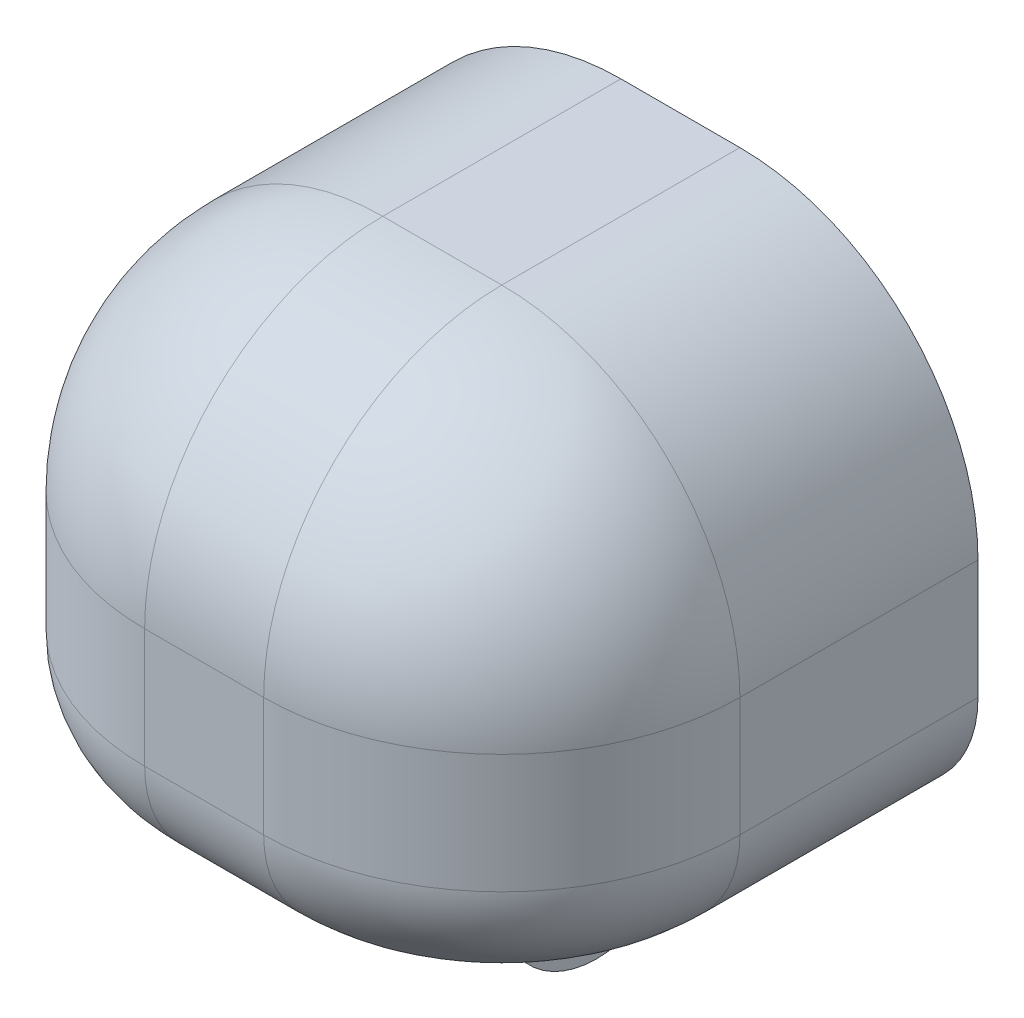
ISO-10303-21;
HEADER;
FILE_DESCRIPTION(('STEP AP214'),'2;1');
FILE_NAME('part.step','',(''),(''),'','','');
FILE_SCHEMA(('AUTOMOTIVE_DESIGN { 1 0 10303 214 1 1 1 1 }'));
ENDSEC;
DATA;
#1=APPLICATION_CONTEXT('core data for automotive mechanical design processes');
#2=APPLICATION_PROTOCOL_DEFINITION('international standard','automotive_design',2000,#1);
#3=PRODUCT_CONTEXT('',#1,'mechanical');
#4=PRODUCT('Part','Part','',(#3));
#5=PRODUCT_RELATED_PRODUCT_CATEGORY('part','',(#4));
#6=PRODUCT_DEFINITION_FORMATION('','',#4);
#7=PRODUCT_DEFINITION_CONTEXT('part definition',#1,'design');
#8=PRODUCT_DEFINITION('design','',#6,#7);
#9=PRODUCT_DEFINITION_SHAPE('','',#8);
#10=(LENGTH_UNIT() NAMED_UNIT(*) SI_UNIT(.MILLI.,.METRE.));
#11=(NAMED_UNIT(*) PLANE_ANGLE_UNIT() SI_UNIT($,.RADIAN.));
#12=(NAMED_UNIT(*) SI_UNIT($,.STERADIAN.) SOLID_ANGLE_UNIT());
#13=UNCERTAINTY_MEASURE_WITH_UNIT(LENGTH_MEASURE(1.E-05),#10,'distance_accuracy_value','');
#14=(GEOMETRIC_REPRESENTATION_CONTEXT(3) GLOBAL_UNCERTAINTY_ASSIGNED_CONTEXT((#13)) GLOBAL_UNIT_ASSIGNED_CONTEXT((#10,
#11,#12)) REPRESENTATION_CONTEXT('',''));
#15=CARTESIAN_POINT('',(0.,0.,0.));
#16=DIRECTION('',(0.,0.,1.));
#17=DIRECTION('',(1.,0.,0.));
#18=AXIS2_PLACEMENT_3D('',#15,#16,#17);
#19=CARTESIAN_POINT('',(-12.5,25.,-12.5));
#20=DIRECTION('',(1.,0.,0.));
#21=DIRECTION('',(0.,0.,-1.));
#22=AXIS2_PLACEMENT_3D('',#19,#20,#21);
#23=PLANE('',#22);
#24=DIRECTION('',(0.,1.,0.));
#25=VECTOR('',#24,1.);
#26=CARTESIAN_POINT('',(-12.5,10.,-7.5));
#27=LINE('',#26,#25);
#28=CARTESIAN_POINT('',(-12.5,10.,-7.5));
#29=VERTEX_POINT('',#28);
#30=CARTESIAN_POINT('',(-12.5,15.,-7.5));
#31=VERTEX_POINT('',#30);
#32=EDGE_CURVE('E509',#29,#31,#27,.T.);
#33=ORIENTED_EDGE('',*,*,#32,.F.);
#34=DIRECTION('',(0.,0.,-1.));
#35=VECTOR('',#34,1.);
#36=CARTESIAN_POINT('',(-12.5,10.,2.5));
#37=LINE('',#36,#35);
#38=CARTESIAN_POINT('',(-12.5,10.,2.5));
#39=VERTEX_POINT('',#38);
#40=EDGE_CURVE('E299',#29,#39,#37,.F.);
#41=ORIENTED_EDGE('',*,*,#40,.T.);
#42=DIRECTION('',(0.,-1.,0.));
#43=VECTOR('',#42,1.);
#44=CARTESIAN_POINT('',(-12.5,25.,2.5));
#45=LINE('',#44,#43);
#46=CARTESIAN_POINT('',(-12.5,15.,2.5));
#47=VERTEX_POINT('',#46);
#48=EDGE_CURVE('E431',#39,#47,#45,.F.);
#49=ORIENTED_EDGE('',*,*,#48,.T.);
#50=DIRECTION('',(0.,0.,1.));
#51=VECTOR('',#50,1.);
#52=CARTESIAN_POINT('',(-12.5,15.,-12.5));
#53=LINE('',#52,#51);
#54=EDGE_CURVE('E446',#47,#31,#53,.F.);
#55=ORIENTED_EDGE('',*,*,#54,.T.);
#56=EDGE_LOOP('',(#33,#41,#49,#55));
#57=FACE_BOUND('',#56,.T.);
#58=ADVANCED_FACE('F74',(#57),#23,.F.);
#59=CARTESIAN_POINT('',(12.5,25.,-12.5));
#60=DIRECTION('',(-1.,0.,0.));
#61=DIRECTION('',(0.,0.,1.));
#62=AXIS2_PLACEMENT_3D('',#59,#60,#61);
#63=PLANE('',#62);
#64=DIRECTION('',(0.,-1.,0.));
#65=VECTOR('',#64,1.);
#66=CARTESIAN_POINT('',(12.5,15.,-7.5));
#67=LINE('',#66,#65);
#68=CARTESIAN_POINT('',(12.5,15.,-7.5));
#69=VERTEX_POINT('',#68);
#70=CARTESIAN_POINT('',(12.5,10.,-7.5));
#71=VERTEX_POINT('',#70);
#72=EDGE_CURVE('E92',#69,#71,#67,.T.);
#73=ORIENTED_EDGE('',*,*,#72,.F.);
#74=DIRECTION('',(0.,0.,-1.));
#75=VECTOR('',#74,1.);
#76=CARTESIAN_POINT('',(12.5,15.,-12.5));
#77=LINE('',#76,#75);
#78=CARTESIAN_POINT('',(12.5,15.,2.5));
#79=VERTEX_POINT('',#78);
#80=EDGE_CURVE('E232',#69,#79,#77,.F.);
#81=ORIENTED_EDGE('',*,*,#80,.T.);
#82=DIRECTION('',(0.,-1.,0.));
#83=VECTOR('',#82,1.);
#84=CARTESIAN_POINT('',(12.5,25.,2.5));
#85=LINE('',#84,#83);
#86=CARTESIAN_POINT('',(12.5,10.,2.5));
#87=VERTEX_POINT('',#86);
#88=EDGE_CURVE('E434',#79,#87,#85,.T.);
#89=ORIENTED_EDGE('',*,*,#88,.T.);
#90=DIRECTION('',(0.,0.,1.));
#91=VECTOR('',#90,1.);
#92=CARTESIAN_POINT('',(12.5,10.,-12.5));
#93=LINE('',#92,#91);
#94=EDGE_CURVE('E235',#87,#71,#93,.F.);
#95=ORIENTED_EDGE('',*,*,#94,.T.);
#96=EDGE_LOOP('',(#73,#81,#89,#95));
#97=FACE_BOUND('',#96,.T.);
#98=ADVANCED_FACE('F230',(#97),#63,.F.);
#99=CARTESIAN_POINT('',(0.,25.,0.));
#100=DIRECTION('',(0.,-1.,0.));
#101=DIRECTION('',(0.,0.,-1.));
#102=AXIS2_PLACEMENT_3D('',#99,#100,#101);
#103=PLANE('',#102);
#104=DIRECTION('',(1.,0.,0.));
#105=VECTOR('',#104,1.);
#106=CARTESIAN_POINT('',(-2.5,25.,-7.5));
#107=LINE('',#106,#105);
#108=CARTESIAN_POINT('',(-2.5,25.,-7.5));
#109=VERTEX_POINT('',#108);
#110=CARTESIAN_POINT('',(2.5,25.,-7.5));
#111=VERTEX_POINT('',#110);
#112=EDGE_CURVE('E221',#109,#111,#107,.T.);
#113=ORIENTED_EDGE('',*,*,#112,.F.);
#114=DIRECTION('',(0.,0.,1.));
#115=VECTOR('',#114,1.);
#116=CARTESIAN_POINT('',(-2.5,25.,0.));
#117=LINE('',#116,#115);
#118=CARTESIAN_POINT('',(-2.5,25.,2.5));
#119=VERTEX_POINT('',#118);
#120=EDGE_CURVE('E443',#109,#119,#117,.T.);
#121=ORIENTED_EDGE('',*,*,#120,.T.);
#122=DIRECTION('',(1.,0.,0.));
#123=VECTOR('',#122,1.);
#124=CARTESIAN_POINT('',(0.,25.,2.5));
#125=LINE('',#124,#123);
#126=CARTESIAN_POINT('',(2.5,25.,2.5));
#127=VERTEX_POINT('',#126);
#128=EDGE_CURVE('E440',#119,#127,#125,.T.);
#129=ORIENTED_EDGE('',*,*,#128,.T.);
#130=DIRECTION('',(0.,0.,-1.));
#131=VECTOR('',#130,1.);
#132=CARTESIAN_POINT('',(2.5,25.,0.));
#133=LINE('',#132,#131);
#134=EDGE_CURVE('E437',#127,#111,#133,.T.);
#135=ORIENTED_EDGE('',*,*,#134,.T.);
#136=EDGE_LOOP('',(#113,#121,#129,#135));
#137=FACE_BOUND('',#136,.T.);
#138=ADVANCED_FACE('F475',(#137),#103,.F.);
#139=CARTESIAN_POINT('',(2.5,15.,0.));
#140=DIRECTION('',(0.,0.,-1.));
#141=DIRECTION('',(-1.,0.,0.));
#142=AXIS2_PLACEMENT_3D('',#139,#140,#141);
#143=CYLINDRICAL_SURFACE('',#142,10.);
#144=ORIENTED_EDGE('',*,*,#80,.F.);
#145=CARTESIAN_POINT('',(2.5,15.,-7.5));
#146=DIRECTION('',(0.,0.,-1.));
#147=DIRECTION('',(-1.,0.,0.));
#148=AXIS2_PLACEMENT_3D('',#145,#146,#147);
#149=CIRCLE('',#148,10.);
#150=EDGE_CURVE('E218',#111,#69,#149,.T.);
#151=ORIENTED_EDGE('',*,*,#150,.F.);
#152=ORIENTED_EDGE('',*,*,#134,.F.);
#153=CARTESIAN_POINT('',(2.5,15.,2.5));
#154=DIRECTION('',(0.,0.,1.));
#155=DIRECTION('',(1.,0.,0.));
#156=AXIS2_PLACEMENT_3D('',#153,#154,#155);
#157=CIRCLE('',#156,10.);
#158=EDGE_CURVE('E242',#79,#127,#157,.T.);
#159=ORIENTED_EDGE('',*,*,#158,.F.);
#160=EDGE_LOOP('',(#144,#151,#152,#159));
#161=FACE_BOUND('',#160,.T.);
#162=ADVANCED_FACE('F240',(#161),#143,.T.);
#163=CARTESIAN_POINT('',(-2.5,15.,0.));
#164=DIRECTION('',(0.,0.,1.));
#165=DIRECTION('',(1.,0.,0.));
#166=AXIS2_PLACEMENT_3D('',#163,#164,#165);
#167=CYLINDRICAL_SURFACE('',#166,10.);
#168=ORIENTED_EDGE('',*,*,#120,.F.);
#169=CARTESIAN_POINT('',(-2.5,15.,-7.5));
#170=DIRECTION('',(0.,0.,-1.));
#171=DIRECTION('',(-1.,0.,0.));
#172=AXIS2_PLACEMENT_3D('',#169,#170,#171);
#173=CIRCLE('',#172,10.);
#174=EDGE_CURVE('E465',#31,#109,#173,.T.);
#175=ORIENTED_EDGE('',*,*,#174,.F.);
#176=ORIENTED_EDGE('',*,*,#54,.F.);
#177=CARTESIAN_POINT('',(-2.5,15.,2.5));
#178=DIRECTION('',(0.,0.,-1.));
#179=DIRECTION('',(-1.,0.,0.));
#180=AXIS2_PLACEMENT_3D('',#177,#178,#179);
#181=CIRCLE('',#180,10.);
#182=EDGE_CURVE('E257',#47,#119,#181,.T.);
#183=ORIENTED_EDGE('',*,*,#182,.T.);
#184=EDGE_LOOP('',(#168,#175,#176,#183));
#185=FACE_BOUND('',#184,.T.);
#186=ADVANCED_FACE('F464',(#185),#167,.T.);
#187=CARTESIAN_POINT('',(0.,5.,0.));
#188=DIRECTION('',(0.,-1.,0.));
#189=DIRECTION('',(0.,0.,-1.));
#190=AXIS2_PLACEMENT_3D('',#187,#188,#189);
#191=PLANE('',#190);
#192=DIRECTION('',(-1.,0.,0.));
#193=VECTOR('',#192,1.);
#194=CARTESIAN_POINT('',(0.,5.,4.));
#195=LINE('',#194,#193);
#196=CARTESIAN_POINT('',(-3.,5.,4.));
#197=VERTEX_POINT('',#196);
#198=CARTESIAN_POINT('',(-4.,5.,4.));
#199=VERTEX_POINT('',#198);
#200=EDGE_CURVE('E393',#197,#199,#195,.T.);
#201=ORIENTED_EDGE('',*,*,#200,.F.);
#202=DIRECTION('',(0.,0.,-1.));
#203=VECTOR('',#202,1.);
#204=CARTESIAN_POINT('',(-3.,5.,0.));
#205=LINE('',#204,#203);
#206=CARTESIAN_POINT('',(-3.,5.,-4.));
#207=VERTEX_POINT('',#206);
#208=EDGE_CURVE('E320',#197,#207,#205,.T.);
#209=ORIENTED_EDGE('',*,*,#208,.T.);
#210=DIRECTION('',(-1.,0.,0.));
#211=VECTOR('',#210,1.);
#212=CARTESIAN_POINT('',(0.,5.,-4.));
#213=LINE('',#212,#211);
#214=CARTESIAN_POINT('',(-4.,5.,-4.));
#215=VERTEX_POINT('',#214);
#216=EDGE_CURVE('E402',#207,#215,#213,.T.);
#217=ORIENTED_EDGE('',*,*,#216,.T.);
#218=DIRECTION('',(0.,0.,-1.));
#219=VECTOR('',#218,1.);
#220=CARTESIAN_POINT('',(-4.,5.,0.));
#221=LINE('',#220,#219);
#222=EDGE_CURVE('E407',#199,#215,#221,.T.);
#223=ORIENTED_EDGE('',*,*,#222,.F.);
#224=EDGE_LOOP('',(#201,#209,#217,#223));
#225=FACE_BOUND('',#224,.T.);
#226=DIRECTION('',(0.,0.,-1.));
#227=VECTOR('',#226,1.);
#228=CARTESIAN_POINT('',(3.,5.,0.));
#229=LINE('',#228,#227);
#230=CARTESIAN_POINT('',(3.,5.,4.));
#231=VERTEX_POINT('',#230);
#232=CARTESIAN_POINT('',(3.,5.,-4.));
#233=VERTEX_POINT('',#232);
#234=EDGE_CURVE('E389',#231,#233,#229,.T.);
#235=ORIENTED_EDGE('',*,*,#234,.F.);
#236=CARTESIAN_POINT('',(4.,5.,4.));
#237=VERTEX_POINT('',#236);
#238=EDGE_CURVE('E394',#237,#231,#195,.T.);
#239=ORIENTED_EDGE('',*,*,#238,.F.);
#240=DIRECTION('',(0.,0.,-1.));
#241=VECTOR('',#240,1.);
#242=CARTESIAN_POINT('',(4.,5.,0.));
#243=LINE('',#242,#241);
#244=CARTESIAN_POINT('',(4.,5.,-4.));
#245=VERTEX_POINT('',#244);
#246=EDGE_CURVE('E398',#237,#245,#243,.T.);
#247=ORIENTED_EDGE('',*,*,#246,.T.);
#248=EDGE_CURVE('E403',#245,#233,#213,.T.);
#249=ORIENTED_EDGE('',*,*,#248,.T.);
#250=EDGE_LOOP('',(#235,#239,#247,#249));
#251=FACE_BOUND('',#250,.T.);
#252=DIRECTION('',(0.,0.,-1.));
#253=VECTOR('',#252,1.);
#254=CARTESIAN_POINT('',(-7.5,5.,-12.5));
#255=LINE('',#254,#253);
#256=CARTESIAN_POINT('',(-7.5,5.,2.5));
#257=VERTEX_POINT('',#256);
#258=CARTESIAN_POINT('',(-7.5,5.,-7.5));
#259=VERTEX_POINT('',#258);
#260=EDGE_CURVE('E251',#257,#259,#255,.T.);
#261=ORIENTED_EDGE('',*,*,#260,.T.);
#262=DIRECTION('',(-1.,0.,0.));
#263=VECTOR('',#262,1.);
#264=CARTESIAN_POINT('',(7.5,5.,-7.5));
#265=LINE('',#264,#263);
#266=CARTESIAN_POINT('',(7.5,5.,-7.5));
#267=VERTEX_POINT('',#266);
#268=EDGE_CURVE('E510',#267,#259,#265,.T.);
#269=ORIENTED_EDGE('',*,*,#268,.F.);
#270=DIRECTION('',(0.,0.,1.));
#271=VECTOR('',#270,1.);
#272=CARTESIAN_POINT('',(7.5,5.,2.5));
#273=LINE('',#272,#271);
#274=CARTESIAN_POINT('',(7.5,5.,2.5));
#275=VERTEX_POINT('',#274);
#276=EDGE_CURVE('E285',#267,#275,#273,.T.);
#277=ORIENTED_EDGE('',*,*,#276,.T.);
#278=CARTESIAN_POINT('',(2.5,5.,2.5));
#279=DIRECTION('',(0.,-1.,0.));
#280=DIRECTION('',(0.,0.,-1.));
#281=AXIS2_PLACEMENT_3D('',#278,#279,#280);
#282=CIRCLE('',#281,5.);
#283=CARTESIAN_POINT('',(2.5,5.,7.5));
#284=VERTEX_POINT('',#283);
#285=EDGE_CURVE('E282',#275,#284,#282,.T.);
#286=ORIENTED_EDGE('',*,*,#285,.T.);
#287=DIRECTION('',(-1.,0.,0.));
#288=VECTOR('',#287,1.);
#289=CARTESIAN_POINT('',(-2.5,5.,7.5));
#290=LINE('',#289,#288);
#291=CARTESIAN_POINT('',(-2.5,5.,7.5));
#292=VERTEX_POINT('',#291);
#293=EDGE_CURVE('E279',#284,#292,#290,.T.);
#294=ORIENTED_EDGE('',*,*,#293,.T.);
#295=CARTESIAN_POINT('',(-2.5,5.,2.5));
#296=DIRECTION('',(0.,-1.,0.));
#297=DIRECTION('',(0.,0.,-1.));
#298=AXIS2_PLACEMENT_3D('',#295,#296,#297);
#299=CIRCLE('',#298,5.);
#300=EDGE_CURVE('E276',#292,#257,#299,.T.);
#301=ORIENTED_EDGE('',*,*,#300,.T.);
#302=EDGE_LOOP('',(#261,#269,#277,#286,#294,#301));
#303=FACE_BOUND('',#302,.T.);
#304=ADVANCED_FACE('F492',(#225,#251,#303),#191,.T.);
#305=CARTESIAN_POINT('',(-7.5,10.,0.));
#306=DIRECTION('',(0.,0.,1.));
#307=DIRECTION('',(1.,0.,0.));
#308=AXIS2_PLACEMENT_3D('',#305,#306,#307);
#309=CYLINDRICAL_SURFACE('',#308,5.);
#310=ORIENTED_EDGE('',*,*,#40,.F.);
#311=CARTESIAN_POINT('',(-7.5,10.,-7.5));
#312=DIRECTION('',(0.,0.,-1.));
#313=DIRECTION('',(-1.,0.,0.));
#314=AXIS2_PLACEMENT_3D('',#311,#312,#313);
#315=CIRCLE('',#314,5.);
#316=EDGE_CURVE('E507',#259,#29,#315,.T.);
#317=ORIENTED_EDGE('',*,*,#316,.F.);
#318=ORIENTED_EDGE('',*,*,#260,.F.);
#319=CARTESIAN_POINT('',(-7.5,10.,2.5));
#320=DIRECTION('',(0.,0.,1.));
#321=DIRECTION('',(1.,0.,0.));
#322=AXIS2_PLACEMENT_3D('',#319,#320,#321);
#323=CIRCLE('',#322,5.);
#324=EDGE_CURVE('E316',#39,#257,#323,.T.);
#325=ORIENTED_EDGE('',*,*,#324,.F.);
#326=EDGE_LOOP('',(#310,#317,#318,#325));
#327=FACE_BOUND('',#326,.T.);
#328=ADVANCED_FACE('F506',(#327),#309,.T.);
#329=CARTESIAN_POINT('',(7.5,10.,0.));
#330=DIRECTION('',(0.,0.,-1.));
#331=DIRECTION('',(-1.,0.,0.));
#332=AXIS2_PLACEMENT_3D('',#329,#330,#331);
#333=CYLINDRICAL_SURFACE('',#332,5.);
#334=ORIENTED_EDGE('',*,*,#276,.F.);
#335=CARTESIAN_POINT('',(7.5,10.,-7.5));
#336=DIRECTION('',(0.,0.,-1.));
#337=DIRECTION('',(-1.,0.,0.));
#338=AXIS2_PLACEMENT_3D('',#335,#336,#337);
#339=CIRCLE('',#338,5.);
#340=EDGE_CURVE('E237',#71,#267,#339,.T.);
#341=ORIENTED_EDGE('',*,*,#340,.F.);
#342=ORIENTED_EDGE('',*,*,#94,.F.);
#343=CARTESIAN_POINT('',(7.5,10.,2.5));
#344=DIRECTION('',(0.,0.,-1.));
#345=DIRECTION('',(-1.,0.,0.));
#346=AXIS2_PLACEMENT_3D('',#343,#344,#345);
#347=CIRCLE('',#346,5.);
#348=EDGE_CURVE('E303',#87,#275,#347,.T.);
#349=ORIENTED_EDGE('',*,*,#348,.T.);
#350=EDGE_LOOP('',(#334,#341,#342,#349));
#351=FACE_BOUND('',#350,.T.);
#352=ADVANCED_FACE('F486',(#351),#333,.T.);
#353=CARTESIAN_POINT('',(0.,5.,4.));
#354=DIRECTION('',(0.,0.,1.));
#355=DIRECTION('',(1.,0.,0.));
#356=AXIS2_PLACEMENT_3D('',#353,#354,#355);
#357=PLANE('',#356);
#358=DIRECTION('',(0.,-1.,0.));
#359=VECTOR('',#358,1.);
#360=CARTESIAN_POINT('',(-4.,5.,4.));
#361=LINE('',#360,#359);
#362=CARTESIAN_POINT('',(-4.,4.,4.));
#363=VERTEX_POINT('',#362);
#364=EDGE_CURVE('E262',#199,#363,#361,.T.);
#365=ORIENTED_EDGE('',*,*,#364,.T.);
#366=DIRECTION('',(-1.,0.,0.));
#367=VECTOR('',#366,1.);
#368=CARTESIAN_POINT('',(0.,4.,4.));
#369=LINE('',#368,#367);
#370=CARTESIAN_POINT('',(-3.,4.,4.));
#371=VERTEX_POINT('',#370);
#372=EDGE_CURVE('E12',#363,#371,#369,.F.);
#373=ORIENTED_EDGE('',*,*,#372,.T.);
#374=DIRECTION('',(0.,-1.,0.));
#375=VECTOR('',#374,1.);
#376=CARTESIAN_POINT('',(-3.,5.,4.));
#377=LINE('',#376,#375);
#378=EDGE_CURVE('E308',#197,#371,#377,.T.);
#379=ORIENTED_EDGE('',*,*,#378,.F.);
#380=ORIENTED_EDGE('',*,*,#200,.T.);
#381=EDGE_LOOP('',(#365,#373,#379,#380));
#382=FACE_BOUND('',#381,.T.);
#383=ADVANCED_FACE('F572',(#382),#357,.T.);
#384=CARTESIAN_POINT('',(0.,5.,-4.));
#385=DIRECTION('',(0.,0.,1.));
#386=DIRECTION('',(1.,0.,0.));
#387=AXIS2_PLACEMENT_3D('',#384,#385,#386);
#388=PLANE('',#387);
#389=DIRECTION('',(0.,-1.,0.));
#390=VECTOR('',#389,1.);
#391=CARTESIAN_POINT('',(-3.,5.,-4.));
#392=LINE('',#391,#390);
#393=CARTESIAN_POINT('',(-3.,4.,-4.));
#394=VERTEX_POINT('',#393);
#395=EDGE_CURVE('E381',#207,#394,#392,.T.);
#396=ORIENTED_EDGE('',*,*,#395,.T.);
#397=DIRECTION('',(-1.,0.,0.));
#398=VECTOR('',#397,1.);
#399=CARTESIAN_POINT('',(-4.,4.,-4.));
#400=LINE('',#399,#398);
#401=CARTESIAN_POINT('',(-4.,4.,-4.));
#402=VERTEX_POINT('',#401);
#403=EDGE_CURVE('E339',#394,#402,#400,.T.);
#404=ORIENTED_EDGE('',*,*,#403,.T.);
#405=DIRECTION('',(0.,-1.,0.));
#406=VECTOR('',#405,1.);
#407=CARTESIAN_POINT('',(-4.,5.,-4.));
#408=LINE('',#407,#406);
#409=EDGE_CURVE('E414',#215,#402,#408,.T.);
#410=ORIENTED_EDGE('',*,*,#409,.F.);
#411=ORIENTED_EDGE('',*,*,#216,.F.);
#412=EDGE_LOOP('',(#396,#404,#410,#411));
#413=FACE_BOUND('',#412,.T.);
#414=ADVANCED_FACE('F626',(#413),#388,.F.);
#415=CARTESIAN_POINT('',(12.5,25.,12.5));
#416=DIRECTION('',(0.,0.,-1.));
#417=DIRECTION('',(-1.,0.,0.));
#418=AXIS2_PLACEMENT_3D('',#415,#416,#417);
#419=PLANE('',#418);
#420=DIRECTION('',(0.,-1.,0.));
#421=VECTOR('',#420,1.);
#422=CARTESIAN_POINT('',(-2.5,25.,12.5));
#423=LINE('',#422,#421);
#424=CARTESIAN_POINT('',(-2.5,15.,12.5));
#425=VERTEX_POINT('',#424);
#426=CARTESIAN_POINT('',(-2.5,10.,12.5));
#427=VERTEX_POINT('',#426);
#428=EDGE_CURVE('E427',#425,#427,#423,.T.);
#429=ORIENTED_EDGE('',*,*,#428,.T.);
#430=DIRECTION('',(-1.,0.,0.));
#431=VECTOR('',#430,1.);
#432=CARTESIAN_POINT('',(2.5,10.,12.5));
#433=LINE('',#432,#431);
#434=CARTESIAN_POINT('',(2.5,10.,12.5));
#435=VERTEX_POINT('',#434);
#436=EDGE_CURVE('E293',#427,#435,#433,.F.);
#437=ORIENTED_EDGE('',*,*,#436,.T.);
#438=DIRECTION('',(0.,-1.,0.));
#439=VECTOR('',#438,1.);
#440=CARTESIAN_POINT('',(2.5,25.,12.5));
#441=LINE('',#440,#439);
#442=CARTESIAN_POINT('',(2.5,15.,12.5));
#443=VERTEX_POINT('',#442);
#444=EDGE_CURVE('E272',#435,#443,#441,.F.);
#445=ORIENTED_EDGE('',*,*,#444,.T.);
#446=DIRECTION('',(1.,0.,0.));
#447=VECTOR('',#446,1.);
#448=CARTESIAN_POINT('',(12.5,15.,12.5));
#449=LINE('',#448,#447);
#450=EDGE_CURVE('E246',#443,#425,#449,.F.);
#451=ORIENTED_EDGE('',*,*,#450,.T.);
#452=EDGE_LOOP('',(#429,#437,#445,#451));
#453=FACE_BOUND('',#452,.T.);
#454=ADVANCED_FACE('F554',(#453),#419,.F.);
#455=CARTESIAN_POINT('',(-2.5,25.,2.5));
#456=DIRECTION('',(0.,-1.,0.));
#457=DIRECTION('',(0.,0.,-1.));
#458=AXIS2_PLACEMENT_3D('',#455,#456,#457);
#459=CYLINDRICAL_SURFACE('',#458,10.);
#460=ORIENTED_EDGE('',*,*,#48,.F.);
#461=CARTESIAN_POINT('',(-2.5,10.,2.5));
#462=DIRECTION('',(0.,-1.,0.));
#463=DIRECTION('',(0.,0.,-1.));
#464=AXIS2_PLACEMENT_3D('',#461,#462,#463);
#465=CIRCLE('',#464,10.);
#466=EDGE_CURVE('E296',#39,#427,#465,.F.);
#467=ORIENTED_EDGE('',*,*,#466,.T.);
#468=ORIENTED_EDGE('',*,*,#428,.F.);
#469=CARTESIAN_POINT('',(-2.5,15.,2.5));
#470=DIRECTION('',(0.,-1.,0.));
#471=DIRECTION('',(0.,0.,-1.));
#472=AXIS2_PLACEMENT_3D('',#469,#470,#471);
#473=CIRCLE('',#472,10.);
#474=EDGE_CURVE('E253',#425,#47,#473,.T.);
#475=ORIENTED_EDGE('',*,*,#474,.T.);
#476=EDGE_LOOP('',(#460,#467,#468,#475));
#477=FACE_BOUND('',#476,.T.);
#478=ADVANCED_FACE('F456',(#477),#459,.T.);
#479=CARTESIAN_POINT('',(2.5,25.,2.5));
#480=DIRECTION('',(0.,-1.,0.));
#481=DIRECTION('',(0.,0.,-1.));
#482=AXIS2_PLACEMENT_3D('',#479,#480,#481);
#483=CYLINDRICAL_SURFACE('',#482,10.);
#484=ORIENTED_EDGE('',*,*,#444,.F.);
#485=CARTESIAN_POINT('',(2.5,10.,2.5));
#486=DIRECTION('',(0.,-1.,0.));
#487=DIRECTION('',(0.,0.,-1.));
#488=AXIS2_PLACEMENT_3D('',#485,#486,#487);
#489=CIRCLE('',#488,10.);
#490=EDGE_CURVE('E290',#435,#87,#489,.F.);
#491=ORIENTED_EDGE('',*,*,#490,.T.);
#492=ORIENTED_EDGE('',*,*,#88,.F.);
#493=CARTESIAN_POINT('',(2.5,15.,2.5));
#494=DIRECTION('',(0.,-1.,0.));
#495=DIRECTION('',(0.,0.,-1.));
#496=AXIS2_PLACEMENT_3D('',#493,#494,#495);
#497=CIRCLE('',#496,10.);
#498=EDGE_CURVE('E245',#79,#443,#497,.T.);
#499=ORIENTED_EDGE('',*,*,#498,.T.);
#500=EDGE_LOOP('',(#484,#491,#492,#499));
#501=FACE_BOUND('',#500,.T.);
#502=ADVANCED_FACE('F480',(#501),#483,.T.);
#503=CARTESIAN_POINT('',(2.5,15.,2.5));
#504=DIRECTION('',(0.,-1.,0.));
#505=DIRECTION('',(0.,0.,-1.));
#506=AXIS2_PLACEMENT_3D('',#503,#504,#505);
#507=SPHERICAL_SURFACE('',#506,10.);
#508=ORIENTED_EDGE('',*,*,#498,.F.);
#509=ORIENTED_EDGE('',*,*,#158,.T.);
#510=CARTESIAN_POINT('',(2.5,15.,2.5));
#511=DIRECTION('',(-1.,0.,0.));
#512=DIRECTION('',(0.,0.,1.));
#513=AXIS2_PLACEMENT_3D('',#510,#511,#512);
#514=CIRCLE('',#513,10.);
#515=EDGE_CURVE('E266',#443,#127,#514,.T.);
#516=ORIENTED_EDGE('',*,*,#515,.F.);
#517=EDGE_LOOP('',(#508,#509,#516));
#518=FACE_BOUND('',#517,.T.);
#519=ADVANCED_FACE('F477',(#518),#507,.T.);
#520=CARTESIAN_POINT('',(0.,15.,2.5));
#521=DIRECTION('',(1.,0.,0.));
#522=DIRECTION('',(0.,0.,-1.));
#523=AXIS2_PLACEMENT_3D('',#520,#521,#522);
#524=CYLINDRICAL_SURFACE('',#523,10.);
#525=CARTESIAN_POINT('',(-2.5,15.,2.5));
#526=DIRECTION('',(-1.,0.,0.));
#527=DIRECTION('',(0.,0.,1.));
#528=AXIS2_PLACEMENT_3D('',#525,#526,#527);
#529=CIRCLE('',#528,10.);
#530=EDGE_CURVE('E261',#425,#119,#529,.T.);
#531=ORIENTED_EDGE('',*,*,#530,.F.);
#532=ORIENTED_EDGE('',*,*,#450,.F.);
#533=ORIENTED_EDGE('',*,*,#515,.T.);
#534=ORIENTED_EDGE('',*,*,#128,.F.);
#535=EDGE_LOOP('',(#531,#532,#533,#534));
#536=FACE_BOUND('',#535,.T.);
#537=ADVANCED_FACE('F472',(#536),#524,.T.);
#538=CARTESIAN_POINT('',(-2.5,15.,2.5));
#539=DIRECTION('',(0.,-1.,0.));
#540=DIRECTION('',(0.,0.,-1.));
#541=AXIS2_PLACEMENT_3D('',#538,#539,#540);
#542=SPHERICAL_SURFACE('',#541,10.);
#543=ORIENTED_EDGE('',*,*,#474,.F.);
#544=ORIENTED_EDGE('',*,*,#530,.T.);
#545=ORIENTED_EDGE('',*,*,#182,.F.);
#546=EDGE_LOOP('',(#543,#544,#545));
#547=FACE_BOUND('',#546,.T.);
#548=ADVANCED_FACE('F468',(#547),#542,.T.);
#549=DIRECTION('',(0.,1.,0.));
#550=VECTOR('',#549,1.);
#551=CARTESIAN_POINT('',(3.,5.,4.));
#552=LINE('',#551,#550);
#553=CARTESIAN_POINT('',(3.,4.,4.));
#554=VERTEX_POINT('',#553);
#555=EDGE_CURVE('E378',#554,#231,#552,.T.);
#556=ORIENTED_EDGE('',*,*,#555,.F.);
#557=DIRECTION('',(-1.,0.,0.));
#558=VECTOR('',#557,1.);
#559=CARTESIAN_POINT('',(0.,4.,4.));
#560=LINE('',#559,#558);
#561=CARTESIAN_POINT('',(4.,4.,4.));
#562=VERTEX_POINT('',#561);
#563=EDGE_CURVE('E336',#554,#562,#560,.F.);
#564=ORIENTED_EDGE('',*,*,#563,.T.);
#565=DIRECTION('',(0.,-1.,0.));
#566=VECTOR('',#565,1.);
#567=CARTESIAN_POINT('',(4.,5.,4.));
#568=LINE('',#567,#566);
#569=EDGE_CURVE('E411',#237,#562,#568,.T.);
#570=ORIENTED_EDGE('',*,*,#569,.F.);
#571=ORIENTED_EDGE('',*,*,#238,.T.);
#572=EDGE_LOOP('',(#556,#564,#570,#571));
#573=FACE_BOUND('',#572,.T.);
#574=ADVANCED_FACE('F563',(#573),#357,.T.);
#575=CARTESIAN_POINT('',(-4.,5.,0.));
#576=DIRECTION('',(-1.,0.,0.));
#577=DIRECTION('',(0.,0.,1.));
#578=AXIS2_PLACEMENT_3D('',#575,#576,#577);
#579=PLANE('',#578);
#580=CARTESIAN_POINT('',(-4.,3.,0.));
#581=DIRECTION('',(-1.,0.,0.));
#582=DIRECTION('',(0.,0.,1.));
#583=AXIS2_PLACEMENT_3D('',#580,#581,#582);
#584=CIRCLE('',#583,1.5);
#585=CARTESIAN_POINT('',(-4.,3.,1.5));
#586=VERTEX_POINT('',#585);
#587=EDGE_CURVE('E521',#586,#586,#584,.T.);
#588=ORIENTED_EDGE('',*,*,#587,.F.);
#589=EDGE_LOOP('',(#588));
#590=FACE_BOUND('',#589,.T.);
#591=ORIENTED_EDGE('',*,*,#409,.T.);
#592=CARTESIAN_POINT('',(-4.,4.,0.));
#593=DIRECTION('',(-1.,0.,0.));
#594=DIRECTION('',(0.,0.,1.));
#595=AXIS2_PLACEMENT_3D('',#592,#593,#594);
#596=CIRCLE('',#595,4.);
#597=CARTESIAN_POINT('',(-4.,0.,0.));
#598=VERTEX_POINT('',#597);
#599=EDGE_CURVE('E346',#402,#598,#596,.T.);
#600=ORIENTED_EDGE('',*,*,#599,.T.);
#601=CARTESIAN_POINT('',(-4.,4.,0.));
#602=DIRECTION('',(-1.,0.,0.));
#603=DIRECTION('',(0.,0.,1.));
#604=AXIS2_PLACEMENT_3D('',#601,#602,#603);
#605=CIRCLE('',#604,4.);
#606=EDGE_CURVE('E343',#598,#363,#605,.T.);
#607=ORIENTED_EDGE('',*,*,#606,.T.);
#608=ORIENTED_EDGE('',*,*,#364,.F.);
#609=ORIENTED_EDGE('',*,*,#222,.T.);
#610=EDGE_LOOP('',(#591,#600,#607,#608,#609));
#611=FACE_BOUND('',#610,.T.);
#612=ADVANCED_FACE('F621',(#590,#611),#579,.T.);
#613=DIRECTION('',(0.,-1.,0.));
#614=VECTOR('',#613,1.);
#615=CARTESIAN_POINT('',(4.,5.,-4.));
#616=LINE('',#615,#614);
#617=CARTESIAN_POINT('',(4.,4.,-4.));
#618=VERTEX_POINT('',#617);
#619=EDGE_CURVE('E418',#245,#618,#616,.T.);
#620=ORIENTED_EDGE('',*,*,#619,.T.);
#621=DIRECTION('',(-1.,0.,0.));
#622=VECTOR('',#621,1.);
#623=CARTESIAN_POINT('',(3.,4.,-4.));
#624=LINE('',#623,#622);
#625=CARTESIAN_POINT('',(3.,4.,-4.));
#626=VERTEX_POINT('',#625);
#627=EDGE_CURVE('E302',#618,#626,#624,.T.);
#628=ORIENTED_EDGE('',*,*,#627,.T.);
#629=DIRECTION('',(0.,1.,0.));
#630=VECTOR('',#629,1.);
#631=CARTESIAN_POINT('',(3.,5.,-4.));
#632=LINE('',#631,#630);
#633=EDGE_CURVE('E357',#626,#233,#632,.T.);
#634=ORIENTED_EDGE('',*,*,#633,.T.);
#635=ORIENTED_EDGE('',*,*,#248,.F.);
#636=EDGE_LOOP('',(#620,#628,#634,#635));
#637=FACE_BOUND('',#636,.T.);
#638=ADVANCED_FACE('F601',(#637),#388,.F.);
#639=CARTESIAN_POINT('',(4.,5.,0.));
#640=DIRECTION('',(-1.,0.,0.));
#641=DIRECTION('',(0.,0.,1.));
#642=AXIS2_PLACEMENT_3D('',#639,#640,#641);
#643=PLANE('',#642);
#644=CARTESIAN_POINT('',(4.,3.,0.));
#645=DIRECTION('',(-1.,0.,0.));
#646=DIRECTION('',(0.,0.,1.));
#647=AXIS2_PLACEMENT_3D('',#644,#645,#646);
#648=CIRCLE('',#647,1.5);
#649=CARTESIAN_POINT('',(4.,3.,1.5));
#650=VERTEX_POINT('',#649);
#651=EDGE_CURVE('E361',#650,#650,#648,.T.);
#652=ORIENTED_EDGE('',*,*,#651,.T.);
#653=EDGE_LOOP('',(#652));
#654=FACE_BOUND('',#653,.T.);
#655=CARTESIAN_POINT('',(4.,4.,0.));
#656=DIRECTION('',(-1.,0.,0.));
#657=DIRECTION('',(0.,0.,1.));
#658=AXIS2_PLACEMENT_3D('',#655,#656,#657);
#659=CIRCLE('',#658,4.);
#660=CARTESIAN_POINT('',(4.,0.,0.));
#661=VERTEX_POINT('',#660);
#662=EDGE_CURVE('E330',#562,#661,#659,.F.);
#663=ORIENTED_EDGE('',*,*,#662,.T.);
#664=CARTESIAN_POINT('',(4.,4.,0.));
#665=DIRECTION('',(-1.,0.,0.));
#666=DIRECTION('',(0.,0.,1.));
#667=AXIS2_PLACEMENT_3D('',#664,#665,#666);
#668=CIRCLE('',#667,4.);
#669=EDGE_CURVE('E333',#661,#618,#668,.F.);
#670=ORIENTED_EDGE('',*,*,#669,.T.);
#671=ORIENTED_EDGE('',*,*,#619,.F.);
#672=ORIENTED_EDGE('',*,*,#246,.F.);
#673=ORIENTED_EDGE('',*,*,#569,.T.);
#674=EDGE_LOOP('',(#663,#670,#671,#672,#673));
#675=FACE_BOUND('',#674,.T.);
#676=ADVANCED_FACE('F597',(#654,#675),#643,.F.);
#677=CARTESIAN_POINT('',(3.,5.,0.));
#678=DIRECTION('',(-1.,0.,0.));
#679=DIRECTION('',(0.,0.,1.));
#680=AXIS2_PLACEMENT_3D('',#677,#678,#679);
#681=PLANE('',#680);
#682=CARTESIAN_POINT('',(3.,3.,0.));
#683=DIRECTION('',(-1.,0.,0.));
#684=DIRECTION('',(0.,0.,1.));
#685=AXIS2_PLACEMENT_3D('',#682,#683,#684);
#686=CIRCLE('',#685,1.5);
#687=CARTESIAN_POINT('',(3.,3.,1.5));
#688=VERTEX_POINT('',#687);
#689=EDGE_CURVE('E367',#688,#688,#686,.T.);
#690=ORIENTED_EDGE('',*,*,#689,.F.);
#691=EDGE_LOOP('',(#690));
#692=FACE_BOUND('',#691,.T.);
#693=ORIENTED_EDGE('',*,*,#633,.F.);
#694=CARTESIAN_POINT('',(3.,4.,0.));
#695=DIRECTION('',(-1.,0.,0.));
#696=DIRECTION('',(0.,0.,1.));
#697=AXIS2_PLACEMENT_3D('',#694,#695,#696);
#698=CIRCLE('',#697,4.);
#699=CARTESIAN_POINT('',(3.,0.,0.));
#700=VERTEX_POINT('',#699);
#701=EDGE_CURVE('E327',#626,#700,#698,.T.);
#702=ORIENTED_EDGE('',*,*,#701,.T.);
#703=CARTESIAN_POINT('',(3.,4.,0.));
#704=DIRECTION('',(-1.,0.,0.));
#705=DIRECTION('',(0.,0.,1.));
#706=AXIS2_PLACEMENT_3D('',#703,#704,#705);
#707=CIRCLE('',#706,4.);
#708=EDGE_CURVE('E324',#700,#554,#707,.T.);
#709=ORIENTED_EDGE('',*,*,#708,.T.);
#710=ORIENTED_EDGE('',*,*,#555,.T.);
#711=ORIENTED_EDGE('',*,*,#234,.T.);
#712=EDGE_LOOP('',(#693,#702,#709,#710,#711));
#713=FACE_BOUND('',#712,.T.);
#714=ADVANCED_FACE('F609',(#692,#713),#681,.T.);
#715=CARTESIAN_POINT('',(-3.,5.,0.));
#716=DIRECTION('',(-1.,0.,0.));
#717=DIRECTION('',(0.,0.,1.));
#718=AXIS2_PLACEMENT_3D('',#715,#716,#717);
#719=PLANE('',#718);
#720=CARTESIAN_POINT('',(-3.,3.,0.));
#721=DIRECTION('',(-1.,0.,0.));
#722=DIRECTION('',(0.,0.,1.));
#723=AXIS2_PLACEMENT_3D('',#720,#721,#722);
#724=CIRCLE('',#723,1.5);
#725=CARTESIAN_POINT('',(-3.,3.,1.5));
#726=VERTEX_POINT('',#725);
#727=EDGE_CURVE('E78',#726,#726,#724,.T.);
#728=ORIENTED_EDGE('',*,*,#727,.T.);
#729=EDGE_LOOP('',(#728));
#730=FACE_BOUND('',#729,.T.);
#731=CARTESIAN_POINT('',(-3.,4.,0.));
#732=DIRECTION('',(-1.,0.,0.));
#733=DIRECTION('',(0.,0.,1.));
#734=AXIS2_PLACEMENT_3D('',#731,#732,#733);
#735=CIRCLE('',#734,4.);
#736=CARTESIAN_POINT('',(-3.,0.,0.));
#737=VERTEX_POINT('',#736);
#738=EDGE_CURVE('E349',#371,#737,#735,.F.);
#739=ORIENTED_EDGE('',*,*,#738,.T.);
#740=CARTESIAN_POINT('',(-3.,4.,0.));
#741=DIRECTION('',(-1.,0.,0.));
#742=DIRECTION('',(0.,0.,1.));
#743=AXIS2_PLACEMENT_3D('',#740,#741,#742);
#744=CIRCLE('',#743,4.);
#745=EDGE_CURVE('E84',#737,#394,#744,.F.);
#746=ORIENTED_EDGE('',*,*,#745,.T.);
#747=ORIENTED_EDGE('',*,*,#395,.F.);
#748=ORIENTED_EDGE('',*,*,#208,.F.);
#749=ORIENTED_EDGE('',*,*,#378,.T.);
#750=EDGE_LOOP('',(#739,#746,#747,#748,#749));
#751=FACE_BOUND('',#750,.T.);
#752=ADVANCED_FACE('F530',(#730,#751),#719,.F.);
#753=CARTESIAN_POINT('',(-2.5,10.,2.5));
#754=DIRECTION('',(0.,-1.,0.));
#755=DIRECTION('',(0.,0.,-1.));
#756=AXIS2_PLACEMENT_3D('',#753,#754,#755);
#757=DEGENERATE_TOROIDAL_SURFACE('',#756,5.,5.,.T.);
#758=ORIENTED_EDGE('',*,*,#324,.T.);
#759=ORIENTED_EDGE('',*,*,#300,.F.);
#760=CARTESIAN_POINT('',(-2.5,10.,7.5));
#761=DIRECTION('',(1.,0.,0.));
#762=DIRECTION('',(0.,0.,-1.));
#763=AXIS2_PLACEMENT_3D('',#760,#761,#762);
#764=CIRCLE('',#763,5.);
#765=EDGE_CURVE('E312',#427,#292,#764,.T.);
#766=ORIENTED_EDGE('',*,*,#765,.F.);
#767=ORIENTED_EDGE('',*,*,#466,.F.);
#768=EDGE_LOOP('',(#758,#759,#766,#767));
#769=FACE_BOUND('',#768,.T.);
#770=ADVANCED_FACE('F501',(#769),#757,.T.);
#771=CARTESIAN_POINT('',(0.,10.,7.5));
#772=DIRECTION('',(1.,0.,0.));
#773=DIRECTION('',(0.,0.,-1.));
#774=AXIS2_PLACEMENT_3D('',#771,#772,#773);
#775=CYLINDRICAL_SURFACE('',#774,5.);
#776=ORIENTED_EDGE('',*,*,#765,.T.);
#777=ORIENTED_EDGE('',*,*,#293,.F.);
#778=CARTESIAN_POINT('',(2.5,10.,7.5));
#779=DIRECTION('',(1.,0.,0.));
#780=DIRECTION('',(0.,0.,-1.));
#781=AXIS2_PLACEMENT_3D('',#778,#779,#780);
#782=CIRCLE('',#781,5.);
#783=EDGE_CURVE('E307',#435,#284,#782,.T.);
#784=ORIENTED_EDGE('',*,*,#783,.F.);
#785=ORIENTED_EDGE('',*,*,#436,.F.);
#786=EDGE_LOOP('',(#776,#777,#784,#785));
#787=FACE_BOUND('',#786,.T.);
#788=ADVANCED_FACE('F496',(#787),#775,.T.);
#789=CARTESIAN_POINT('',(2.5,10.,2.5));
#790=DIRECTION('',(0.,-1.,0.));
#791=DIRECTION('',(0.,0.,-1.));
#792=AXIS2_PLACEMENT_3D('',#789,#790,#791);
#793=DEGENERATE_TOROIDAL_SURFACE('',#792,5.,5.,.T.);
#794=ORIENTED_EDGE('',*,*,#783,.T.);
#795=ORIENTED_EDGE('',*,*,#285,.F.);
#796=ORIENTED_EDGE('',*,*,#348,.F.);
#797=ORIENTED_EDGE('',*,*,#490,.F.);
#798=EDGE_LOOP('',(#794,#795,#796,#797));
#799=FACE_BOUND('',#798,.T.);
#800=ADVANCED_FACE('F489',(#799),#793,.T.);
#801=CARTESIAN_POINT('',(0.,4.,0.));
#802=DIRECTION('',(-1.,0.,0.));
#803=DIRECTION('',(0.,0.,1.));
#804=AXIS2_PLACEMENT_3D('',#801,#802,#803);
#805=CYLINDRICAL_SURFACE('',#804,4.);
#806=DIRECTION('',(-1.,0.,0.));
#807=VECTOR('',#806,1.);
#808=CARTESIAN_POINT('',(0.,0.,0.));
#809=LINE('',#808,#807);
#810=EDGE_CURVE('E354',#661,#700,#809,.T.);
#811=ORIENTED_EDGE('',*,*,#810,.F.);
#812=ORIENTED_EDGE('',*,*,#662,.F.);
#813=ORIENTED_EDGE('',*,*,#563,.F.);
#814=ORIENTED_EDGE('',*,*,#708,.F.);
#815=EDGE_LOOP('',(#811,#812,#813,#814));
#816=FACE_BOUND('',#815,.T.);
#817=ADVANCED_FACE('F575',(#816),#805,.T.);
#818=CARTESIAN_POINT('',(0.,4.,0.));
#819=DIRECTION('',(1.,0.,0.));
#820=DIRECTION('',(0.,0.,-1.));
#821=AXIS2_PLACEMENT_3D('',#818,#819,#820);
#822=CYLINDRICAL_SURFACE('',#821,4.);
#823=ORIENTED_EDGE('',*,*,#669,.F.);
#824=ORIENTED_EDGE('',*,*,#810,.T.);
#825=ORIENTED_EDGE('',*,*,#701,.F.);
#826=ORIENTED_EDGE('',*,*,#627,.F.);
#827=EDGE_LOOP('',(#823,#824,#825,#826));
#828=FACE_BOUND('',#827,.T.);
#829=ADVANCED_FACE('F582',(#828),#822,.T.);
#830=CARTESIAN_POINT('',(0.,4.,0.));
#831=DIRECTION('',(-1.,0.,0.));
#832=DIRECTION('',(0.,0.,1.));
#833=AXIS2_PLACEMENT_3D('',#830,#831,#832);
#834=CYLINDRICAL_SURFACE('',#833,4.);
#835=DIRECTION('',(-1.,0.,0.));
#836=VECTOR('',#835,1.);
#837=CARTESIAN_POINT('',(0.,0.,0.));
#838=LINE('',#837,#836);
#839=EDGE_CURVE('E358',#737,#598,#838,.T.);
#840=ORIENTED_EDGE('',*,*,#839,.F.);
#841=ORIENTED_EDGE('',*,*,#738,.F.);
#842=ORIENTED_EDGE('',*,*,#372,.F.);
#843=ORIENTED_EDGE('',*,*,#606,.F.);
#844=EDGE_LOOP('',(#840,#841,#842,#843));
#845=FACE_BOUND('',#844,.T.);
#846=ADVANCED_FACE('F76',(#845),#834,.T.);
#847=CARTESIAN_POINT('',(0.,4.,0.));
#848=DIRECTION('',(1.,0.,0.));
#849=DIRECTION('',(0.,0.,-1.));
#850=AXIS2_PLACEMENT_3D('',#847,#848,#849);
#851=CYLINDRICAL_SURFACE('',#850,4.);
#852=ORIENTED_EDGE('',*,*,#745,.F.);
#853=ORIENTED_EDGE('',*,*,#839,.T.);
#854=ORIENTED_EDGE('',*,*,#599,.F.);
#855=ORIENTED_EDGE('',*,*,#403,.F.);
#856=EDGE_LOOP('',(#852,#853,#854,#855));
#857=FACE_BOUND('',#856,.T.);
#858=ADVANCED_FACE('F536',(#857),#851,.T.);
#859=CARTESIAN_POINT('',(11.,3.,0.));
#860=DIRECTION('',(-1.,0.,0.));
#861=DIRECTION('',(0.,0.,1.));
#862=AXIS2_PLACEMENT_3D('',#859,#860,#861);
#863=CYLINDRICAL_SURFACE('',#862,1.5);
#864=CARTESIAN_POINT('',(-4.,3.,1.5));
#865=CARTESIAN_POINT('',(-3.98958333333333,3.,1.5));
#866=CARTESIAN_POINT('',(-3.97916666666667,3.,1.5));
#867=CARTESIAN_POINT('',(-3.95833333333333,3.,1.5));
#868=CARTESIAN_POINT('',(-3.94791666666667,3.,1.5));
#869=CARTESIAN_POINT('',(-3.92708333333333,3.,1.5));
#870=CARTESIAN_POINT('',(-3.91666666666667,3.,1.5));
#871=CARTESIAN_POINT('',(-3.89583333333333,3.,1.5));
#872=CARTESIAN_POINT('',(-3.88541666666667,3.,1.5));
#873=CARTESIAN_POINT('',(-3.86458333333333,3.,1.5));
#874=CARTESIAN_POINT('',(-3.85416666666667,3.,1.5));
#875=CARTESIAN_POINT('',(-3.83333333333333,3.,1.5));
#876=CARTESIAN_POINT('',(-3.82291666666667,3.,1.5));
#877=CARTESIAN_POINT('',(-3.80208333333333,3.,1.5));
#878=CARTESIAN_POINT('',(-3.79166666666667,3.,1.5));
#879=CARTESIAN_POINT('',(-3.77083333333333,3.,1.5));
#880=CARTESIAN_POINT('',(-3.76041666666667,3.,1.5));
#881=CARTESIAN_POINT('',(-3.73958333333333,3.,1.5));
#882=CARTESIAN_POINT('',(-3.72916666666667,3.,1.5));
#883=CARTESIAN_POINT('',(-3.70833333333333,3.,1.5));
#884=CARTESIAN_POINT('',(-3.69791666666667,3.,1.5));
#885=CARTESIAN_POINT('',(-3.67708333333333,3.,1.5));
#886=CARTESIAN_POINT('',(-3.66666666666667,3.,1.5));
#887=CARTESIAN_POINT('',(-3.64583333333333,3.,1.5));
#888=CARTESIAN_POINT('',(-3.63541666666667,3.,1.5));
#889=CARTESIAN_POINT('',(-3.61458333333333,3.,1.5));
#890=CARTESIAN_POINT('',(-3.60416666666667,3.,1.5));
#891=CARTESIAN_POINT('',(-3.58333333333333,3.,1.5));
#892=CARTESIAN_POINT('',(-3.57291666666667,3.,1.5));
#893=CARTESIAN_POINT('',(-3.55208333333333,3.,1.5));
#894=CARTESIAN_POINT('',(-3.54166666666667,3.,1.5));
#895=CARTESIAN_POINT('',(-3.52083333333333,3.,1.5));
#896=CARTESIAN_POINT('',(-3.51041666666667,3.,1.5));
#897=CARTESIAN_POINT('',(-3.48958333333333,3.,1.5));
#898=CARTESIAN_POINT('',(-3.47916666666667,3.,1.5));
#899=CARTESIAN_POINT('',(-3.45833333333333,3.,1.5));
#900=CARTESIAN_POINT('',(-3.44791666666667,3.,1.5));
#901=CARTESIAN_POINT('',(-3.42708333333333,3.,1.5));
#902=CARTESIAN_POINT('',(-3.41666666666667,3.,1.5));
#903=CARTESIAN_POINT('',(-3.39583333333333,3.,1.5));
#904=CARTESIAN_POINT('',(-3.38541666666667,3.,1.5));
#905=CARTESIAN_POINT('',(-3.36458333333333,3.,1.5));
#906=CARTESIAN_POINT('',(-3.35416666666667,3.,1.5));
#907=CARTESIAN_POINT('',(-3.33333333333333,3.,1.5));
#908=CARTESIAN_POINT('',(-3.32291666666667,3.,1.5));
#909=CARTESIAN_POINT('',(-3.30208333333333,3.,1.5));
#910=CARTESIAN_POINT('',(-3.29166666666667,3.,1.5));
#911=CARTESIAN_POINT('',(-3.27083333333334,3.,1.5));
#912=CARTESIAN_POINT('',(-3.26041666666667,3.,1.5));
#913=CARTESIAN_POINT('',(-3.23958333333334,3.,1.5));
#914=CARTESIAN_POINT('',(-3.22916666666667,3.,1.5));
#915=CARTESIAN_POINT('',(-3.20833333333334,3.,1.5));
#916=CARTESIAN_POINT('',(-3.19791666666667,3.,1.5));
#917=CARTESIAN_POINT('',(-3.17708333333334,3.,1.5));
#918=CARTESIAN_POINT('',(-3.16666666666667,3.,1.5));
#919=CARTESIAN_POINT('',(-3.14583333333334,3.,1.5));
#920=CARTESIAN_POINT('',(-3.13541666666667,3.,1.5));
#921=CARTESIAN_POINT('',(-3.11458333333334,3.,1.5));
#922=CARTESIAN_POINT('',(-3.10416666666667,3.,1.5));
#923=CARTESIAN_POINT('',(-3.08333333333334,3.,1.5));
#924=CARTESIAN_POINT('',(-3.07291666666667,3.,1.5));
#925=CARTESIAN_POINT('',(-3.05208333333334,3.,1.5));
#926=CARTESIAN_POINT('',(-3.04166666666667,3.,1.5));
#927=CARTESIAN_POINT('',(-3.02083333333334,3.,1.5));
#928=CARTESIAN_POINT('',(-3.01041666666667,3.,1.5));
#929=CARTESIAN_POINT('',(-3.,3.,1.5));
#930=B_SPLINE_CURVE_WITH_KNOTS('',3,(#864,#865,#866,#867,#868,#869,#870,#871,#872,#873,#874,
#875,#876,#877,#878,#879,#880,#881,#882,#883,#884,#885,#886,#887,#888,#889,#890,#891,#892,#893,
#894,#895,#896,#897,#898,#899,#900,#901,#902,#903,#904,#905,#906,#907,#908,#909,#910,#911,#912,
#913,#914,#915,#916,#917,#918,#919,#920,#921,#922,#923,#924,#925,#926,#927,#928,#929),
.UNSPECIFIED.,.F.,.F.,(4,2,2,2,2,2,2,2,2,2,2,2,2,2,2,2,2,2,2,2,2,2,2,2,2,2,2,2,2,2,2,2,4),(0.,
0.03125,0.0625000000000001,0.0937500000000001,0.125,0.15625,0.1875,0.21875,0.25,
0.281249999999999,0.312499999999999,0.343749999999999,0.374999999999999,0.406249999999999,
0.437499999999999,0.468749999999999,0.499999999999999,0.531249999999999,0.562499999999999,
0.593749999999999,0.624999999999999,0.656249999999999,0.687499999999999,0.718749999999999,
0.749999999999997,0.781249999999997,0.812499999999997,0.843749999999997,0.874999999999997,
0.906249999999997,0.937499999999997,0.968749999999997,0.999999999999997),.UNSPECIFIED.);
#931=EDGE_CURVE('BSEAM533',#586,#726,#930,.T.);
#932=ORIENTED_EDGE('',*,*,#587,.T.);
#933=ORIENTED_EDGE('',*,*,#727,.F.);
#934=ORIENTED_EDGE('',*,*,#931,.T.);
#935=ORIENTED_EDGE('',*,*,#931,.F.);
#936=EDGE_LOOP('',(#932,#934,#933,#935));
#937=FACE_BOUND('',#936,.T.);
#938=ADVANCED_FACE('F533',(#937),#863,.F.);
#939=CARTESIAN_POINT('',(3.,3.,1.5));
#940=CARTESIAN_POINT('',(3.01041666666667,3.,1.5));
#941=CARTESIAN_POINT('',(3.02083333333333,3.,1.5));
#942=CARTESIAN_POINT('',(3.04166666666667,3.,1.5));
#943=CARTESIAN_POINT('',(3.05208333333333,3.,1.5));
#944=CARTESIAN_POINT('',(3.07291666666667,3.,1.5));
#945=CARTESIAN_POINT('',(3.08333333333333,3.,1.5));
#946=CARTESIAN_POINT('',(3.10416666666667,3.,1.5));
#947=CARTESIAN_POINT('',(3.11458333333333,3.,1.5));
#948=CARTESIAN_POINT('',(3.13541666666667,3.,1.5));
#949=CARTESIAN_POINT('',(3.14583333333333,3.,1.5));
#950=CARTESIAN_POINT('',(3.16666666666667,3.,1.5));
#951=CARTESIAN_POINT('',(3.17708333333333,3.,1.5));
#952=CARTESIAN_POINT('',(3.19791666666667,3.,1.5));
#953=CARTESIAN_POINT('',(3.20833333333333,3.,1.5));
#954=CARTESIAN_POINT('',(3.22916666666667,3.,1.5));
#955=CARTESIAN_POINT('',(3.23958333333333,3.,1.5));
#956=CARTESIAN_POINT('',(3.26041666666667,3.,1.5));
#957=CARTESIAN_POINT('',(3.27083333333333,3.,1.5));
#958=CARTESIAN_POINT('',(3.29166666666667,3.,1.5));
#959=CARTESIAN_POINT('',(3.30208333333333,3.,1.5));
#960=CARTESIAN_POINT('',(3.32291666666667,3.,1.5));
#961=CARTESIAN_POINT('',(3.33333333333333,3.,1.5));
#962=CARTESIAN_POINT('',(3.35416666666667,3.,1.5));
#963=CARTESIAN_POINT('',(3.36458333333333,3.,1.5));
#964=CARTESIAN_POINT('',(3.38541666666667,3.,1.5));
#965=CARTESIAN_POINT('',(3.39583333333333,3.,1.5));
#966=CARTESIAN_POINT('',(3.41666666666667,3.,1.5));
#967=CARTESIAN_POINT('',(3.42708333333333,3.,1.5));
#968=CARTESIAN_POINT('',(3.44791666666667,3.,1.5));
#969=CARTESIAN_POINT('',(3.45833333333333,3.,1.5));
#970=CARTESIAN_POINT('',(3.47916666666667,3.,1.5));
#971=CARTESIAN_POINT('',(3.48958333333333,3.,1.5));
#972=CARTESIAN_POINT('',(3.51041666666667,3.,1.5));
#973=CARTESIAN_POINT('',(3.52083333333333,3.,1.5));
#974=CARTESIAN_POINT('',(3.54166666666667,3.,1.5));
#975=CARTESIAN_POINT('',(3.55208333333333,3.,1.5));
#976=CARTESIAN_POINT('',(3.57291666666667,3.,1.5));
#977=CARTESIAN_POINT('',(3.58333333333333,3.,1.5));
#978=CARTESIAN_POINT('',(3.60416666666667,3.,1.5));
#979=CARTESIAN_POINT('',(3.61458333333333,3.,1.5));
#980=CARTESIAN_POINT('',(3.63541666666667,3.,1.5));
#981=CARTESIAN_POINT('',(3.64583333333333,3.,1.5));
#982=CARTESIAN_POINT('',(3.66666666666667,3.,1.5));
#983=CARTESIAN_POINT('',(3.67708333333333,3.,1.5));
#984=CARTESIAN_POINT('',(3.69791666666667,3.,1.5));
#985=CARTESIAN_POINT('',(3.70833333333333,3.,1.5));
#986=CARTESIAN_POINT('',(3.72916666666667,3.,1.5));
#987=CARTESIAN_POINT('',(3.73958333333333,3.,1.5));
#988=CARTESIAN_POINT('',(3.76041666666667,3.,1.5));
#989=CARTESIAN_POINT('',(3.77083333333333,3.,1.5));
#990=CARTESIAN_POINT('',(3.79166666666667,3.,1.5));
#991=CARTESIAN_POINT('',(3.80208333333333,3.,1.5));
#992=CARTESIAN_POINT('',(3.82291666666667,3.,1.5));
#993=CARTESIAN_POINT('',(3.83333333333333,3.,1.5));
#994=CARTESIAN_POINT('',(3.85416666666667,3.,1.5));
#995=CARTESIAN_POINT('',(3.86458333333333,3.,1.5));
#996=CARTESIAN_POINT('',(3.88541666666667,3.,1.5));
#997=CARTESIAN_POINT('',(3.89583333333333,3.,1.5));
#998=CARTESIAN_POINT('',(3.91666666666667,3.,1.5));
#999=CARTESIAN_POINT('',(3.92708333333333,3.,1.5));
#1000=CARTESIAN_POINT('',(3.94791666666667,3.,1.5));
#1001=CARTESIAN_POINT('',(3.95833333333333,3.,1.5));
#1002=CARTESIAN_POINT('',(3.97916666666667,3.,1.5));
#1003=CARTESIAN_POINT('',(3.98958333333333,3.,1.5));
#1004=CARTESIAN_POINT('',(4.,3.,1.5));
#1005=B_SPLINE_CURVE_WITH_KNOTS('',3,(#939,#940,#941,#942,#943,#944,#945,#946,#947,#948,#949,
#950,#951,#952,#953,#954,#955,#956,#957,#958,#959,#960,#961,#962,#963,#964,#965,#966,#967,#968,
#969,#970,#971,#972,#973,#974,#975,#976,#977,#978,#979,#980,#981,#982,#983,#984,#985,#986,#987,
#988,#989,#990,#991,#992,#993,#994,#995,#996,#997,#998,#999,#1000,#1001,#1002,#1003,#1004),
.UNSPECIFIED.,.F.,.F.,(4,2,2,2,2,2,2,2,2,2,2,2,2,2,2,2,2,2,2,2,2,2,2,2,2,2,2,2,2,2,2,2,4),(0.,
0.03125,0.0625000000000001,0.0937500000000001,0.125,0.15625,0.1875,0.218749999999999,
0.249999999999999,0.281249999999999,0.312499999999999,0.343749999999999,0.374999999999999,
0.40625,0.4375,0.46875,0.5,0.53125,0.5625,0.59375,0.625,0.65625,0.6875,0.71875,0.75,0.78125,
0.8125,0.84375,0.875,0.90625,0.9375,0.96875,1.),.UNSPECIFIED.);
#1006=EDGE_CURVE('BSEAM535',#688,#650,#1005,.T.);
#1007=ORIENTED_EDGE('',*,*,#689,.T.);
#1008=ORIENTED_EDGE('',*,*,#651,.F.);
#1009=ORIENTED_EDGE('',*,*,#1006,.T.);
#1010=ORIENTED_EDGE('',*,*,#1006,.F.);
#1011=EDGE_LOOP('',(#1007,#1009,#1008,#1010));
#1012=FACE_BOUND('',#1011,.T.);
#1013=ADVANCED_FACE('F535',(#1012),#863,.F.);
#1014=CARTESIAN_POINT('',(2.5,15.,-7.5));
#1015=DIRECTION('',(0.,0.,-1.));
#1016=DIRECTION('',(-1.,0.,0.));
#1017=AXIS2_PLACEMENT_3D('',#1014,#1015,#1016);
#1018=PLANE('',#1017);
#1019=ORIENTED_EDGE('',*,*,#150,.T.);
#1020=ORIENTED_EDGE('',*,*,#72,.T.);
#1021=ORIENTED_EDGE('',*,*,#340,.T.);
#1022=ORIENTED_EDGE('',*,*,#268,.T.);
#1023=ORIENTED_EDGE('',*,*,#316,.T.);
#1024=ORIENTED_EDGE('',*,*,#32,.T.);
#1025=ORIENTED_EDGE('',*,*,#174,.T.);
#1026=ORIENTED_EDGE('',*,*,#112,.T.);
#1027=EDGE_LOOP('',(#1019,#1020,#1021,#1022,#1023,#1024,#1025,#1026));
#1028=FACE_BOUND('',#1027,.T.);
#1029=ADVANCED_FACE('F219',(#1028),#1018,.T.);
#1030=CLOSED_SHELL('',(#58,#98,#138,#162,#186,#304,#328,#352,#383,#414,#454,#478,#502,#519,#537,
#548,#574,#612,#638,#676,#714,#752,#770,#788,#800,#817,#829,#846,#858,#938,#1013,#1029));
#1031=MANIFOLD_SOLID_BREP('B2',#1030);
#1032=ADVANCED_BREP_SHAPE_REPRESENTATION('',(#18,#1031),#14);
#1033=SHAPE_DEFINITION_REPRESENTATION(#9,#1032);
ENDSEC;
END-ISO-10303-21;
